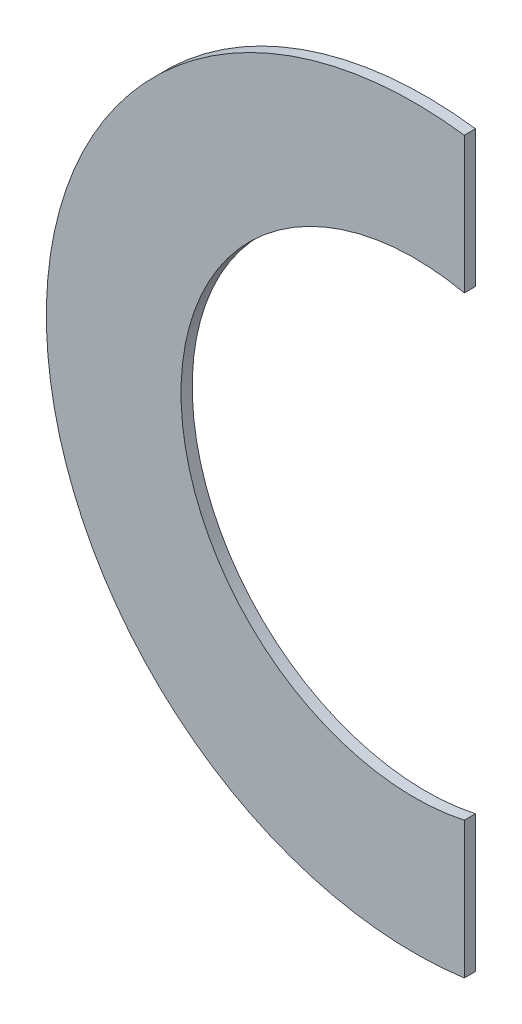
ISO-10303-21;
HEADER;
FILE_DESCRIPTION(('STEP AP214'),'2;1');
FILE_NAME('part.step','',(''),(''),'','','');
FILE_SCHEMA(('AUTOMOTIVE_DESIGN { 1 0 10303 214 1 1 1 1 }'));
ENDSEC;
DATA;
#1=APPLICATION_CONTEXT('core data for automotive mechanical design processes');
#2=APPLICATION_PROTOCOL_DEFINITION('international standard','automotive_design',2000,#1);
#3=PRODUCT_CONTEXT('',#1,'mechanical');
#4=PRODUCT('Part','Part','',(#3));
#5=PRODUCT_RELATED_PRODUCT_CATEGORY('part','',(#4));
#6=PRODUCT_DEFINITION_FORMATION('','',#4);
#7=PRODUCT_DEFINITION_CONTEXT('part definition',#1,'design');
#8=PRODUCT_DEFINITION('design','',#6,#7);
#9=PRODUCT_DEFINITION_SHAPE('','',#8);
#10=(LENGTH_UNIT() NAMED_UNIT(*) SI_UNIT(.MILLI.,.METRE.));
#11=(NAMED_UNIT(*) PLANE_ANGLE_UNIT() SI_UNIT($,.RADIAN.));
#12=(NAMED_UNIT(*) SI_UNIT($,.STERADIAN.) SOLID_ANGLE_UNIT());
#13=UNCERTAINTY_MEASURE_WITH_UNIT(LENGTH_MEASURE(1.E-05),#10,'distance_accuracy_value','');
#14=(GEOMETRIC_REPRESENTATION_CONTEXT(3) GLOBAL_UNCERTAINTY_ASSIGNED_CONTEXT((#13)) GLOBAL_UNIT_ASSIGNED_CONTEXT((#10,
#11,#12)) REPRESENTATION_CONTEXT('',''));
#15=CARTESIAN_POINT('',(0.,0.,0.));
#16=DIRECTION('',(0.,0.,1.));
#17=DIRECTION('',(1.,0.,0.));
#18=AXIS2_PLACEMENT_3D('',#15,#16,#17);
#19=CARTESIAN_POINT('',(0.,0.,0.05));
#20=DIRECTION('',(0.,0.,1.));
#21=DIRECTION('',(1.,0.,0.));
#22=AXIS2_PLACEMENT_3D('',#19,#20,#21);
#23=PLANE('',#22);
#24=DIRECTION('',(0.,1.,0.));
#25=VECTOR('',#24,1.);
#26=CARTESIAN_POINT('',(-0.546694,0.,0.05));
#27=LINE('',#26,#25);
#28=CARTESIAN_POINT('',(-0.546694,-1.60173186517877,0.05));
#29=VERTEX_POINT('',#28);
#30=CARTESIAN_POINT('',(-0.546694,-0.991637831880797,0.05));
#31=VERTEX_POINT('',#30);
#32=EDGE_CURVE('E54',#29,#31,#27,.T.);
#33=ORIENTED_EDGE('',*,*,#32,.T.);
#34=CARTESIAN_POINT('',(-0.7682882978671,0.027718,0.05));
#35=DIRECTION('',(0.,0.,1.));
#36=DIRECTION('',(1.,0.,0.));
#37=AXIS2_PLACEMENT_3D('',#34,#35,#36);
#38=CIRCLE('',#37,1.043163623233);
#39=CARTESIAN_POINT('',(-0.546694,1.0470738318809,0.05));
#40=VERTEX_POINT('',#39);
#41=EDGE_CURVE('E20',#31,#40,#38,.F.);
#42=ORIENTED_EDGE('',*,*,#41,.T.);
#43=DIRECTION('',(0.,1.,0.));
#44=VECTOR('',#43,1.);
#45=CARTESIAN_POINT('',(-0.546694,1.047073831881,0.05));
#46=LINE('',#45,#44);
#47=CARTESIAN_POINT('',(-0.546694000000031,1.65716686517854,0.05));
#48=VERTEX_POINT('',#47);
#49=EDGE_CURVE('E67',#48,#40,#46,.F.);
#50=ORIENTED_EDGE('',*,*,#49,.F.);
#51=CARTESIAN_POINT('',(-0.7682893867849,0.0277175,0.05));
#52=DIRECTION('',(0.,0.,1.));
#53=DIRECTION('',(1.,0.,0.));
#54=AXIS2_PLACEMENT_3D('',#51,#52,#53);
#55=CIRCLE('',#54,1.644448159452);
#56=EDGE_CURVE('E58',#29,#48,#55,.F.);
#57=ORIENTED_EDGE('',*,*,#56,.F.);
#58=EDGE_LOOP('',(#33,#42,#50,#57));
#59=FACE_BOUND('',#58,.T.);
#60=ADVANCED_FACE('F17',(#59),#23,.T.);
#61=CARTESIAN_POINT('',(-0.7682882978671,0.027718,0.));
#62=DIRECTION('',(0.,0.,1.));
#63=DIRECTION('',(1.,0.,0.));
#64=AXIS2_PLACEMENT_3D('',#61,#62,#63);
#65=CYLINDRICAL_SURFACE('',#64,1.043163623233);
#66=ORIENTED_EDGE('',*,*,#41,.F.);
#67=DIRECTION('',(0.,0.,-1.));
#68=VECTOR('',#67,1.);
#69=CARTESIAN_POINT('',(-0.546694,-0.9916378318808,0.));
#70=LINE('',#69,#68);
#71=CARTESIAN_POINT('',(-0.546694,-0.991637831880797,0.));
#72=VERTEX_POINT('',#71);
#73=EDGE_CURVE('E65',#72,#31,#70,.F.);
#74=ORIENTED_EDGE('',*,*,#73,.F.);
#75=CARTESIAN_POINT('',(-0.7682882978671,0.027718,0.));
#76=DIRECTION('',(0.,0.,1.));
#77=DIRECTION('',(1.,0.,0.));
#78=AXIS2_PLACEMENT_3D('',#75,#76,#77);
#79=CIRCLE('',#78,1.043163623233);
#80=CARTESIAN_POINT('',(-0.546694,1.0470738318809,0.));
#81=VERTEX_POINT('',#80);
#82=EDGE_CURVE('E71',#72,#81,#79,.F.);
#83=ORIENTED_EDGE('',*,*,#82,.T.);
#84=DIRECTION('',(0.,0.,-1.));
#85=VECTOR('',#84,1.);
#86=CARTESIAN_POINT('',(-0.546694,1.047073831881,0.));
#87=LINE('',#86,#85);
#88=EDGE_CURVE('E66',#40,#81,#87,.T.);
#89=ORIENTED_EDGE('',*,*,#88,.F.);
#90=EDGE_LOOP('',(#66,#74,#83,#89));
#91=FACE_BOUND('',#90,.T.);
#92=ADVANCED_FACE('F63',(#91),#65,.F.);
#93=CARTESIAN_POINT('',(-0.546694,1.047073831881,0.));
#94=DIRECTION('',(1.,0.,0.));
#95=DIRECTION('',(0.,0.,-1.));
#96=AXIS2_PLACEMENT_3D('',#93,#94,#95);
#97=PLANE('',#96);
#98=ORIENTED_EDGE('',*,*,#88,.T.);
#99=DIRECTION('',(0.,1.,0.));
#100=VECTOR('',#99,1.);
#101=CARTESIAN_POINT('',(-0.546694,0.,0.));
#102=LINE('',#101,#100);
#103=CARTESIAN_POINT('',(-0.546694000000031,1.65716686517854,0.));
#104=VERTEX_POINT('',#103);
#105=EDGE_CURVE('E81',#81,#104,#102,.T.);
#106=ORIENTED_EDGE('',*,*,#105,.T.);
#107=DIRECTION('',(0.,0.,1.));
#108=VECTOR('',#107,1.);
#109=CARTESIAN_POINT('',(-0.546694000000063,1.65716686517854,0.));
#110=LINE('',#109,#108);
#111=EDGE_CURVE('E69',#48,#104,#110,.F.);
#112=ORIENTED_EDGE('',*,*,#111,.F.);
#113=ORIENTED_EDGE('',*,*,#49,.T.);
#114=EDGE_LOOP('',(#98,#106,#112,#113));
#115=FACE_BOUND('',#114,.T.);
#116=ADVANCED_FACE('F88',(#115),#97,.T.);
#117=CARTESIAN_POINT('',(-0.7682893867849,0.0277175,0.));
#118=DIRECTION('',(0.,0.,1.));
#119=DIRECTION('',(1.,0.,0.));
#120=AXIS2_PLACEMENT_3D('',#117,#118,#119);
#121=CYLINDRICAL_SURFACE('',#120,1.644448159452);
#122=ORIENTED_EDGE('',*,*,#111,.T.);
#123=CARTESIAN_POINT('',(-0.7682893867849,0.0277175,0.));
#124=DIRECTION('',(0.,0.,1.));
#125=DIRECTION('',(1.,0.,0.));
#126=AXIS2_PLACEMENT_3D('',#123,#124,#125);
#127=CIRCLE('',#126,1.644448159452);
#128=CARTESIAN_POINT('',(-0.546694,-1.60173186517877,0.));
#129=VERTEX_POINT('',#128);
#130=EDGE_CURVE('E26',#104,#129,#127,.T.);
#131=ORIENTED_EDGE('',*,*,#130,.T.);
#132=DIRECTION('',(0.,0.,-1.));
#133=VECTOR('',#132,1.);
#134=CARTESIAN_POINT('',(-0.546694,-1.601731865179,0.));
#135=LINE('',#134,#133);
#136=EDGE_CURVE('E34',#29,#129,#135,.T.);
#137=ORIENTED_EDGE('',*,*,#136,.F.);
#138=ORIENTED_EDGE('',*,*,#56,.T.);
#139=EDGE_LOOP('',(#122,#131,#137,#138));
#140=FACE_BOUND('',#139,.T.);
#141=ADVANCED_FACE('F83',(#140),#121,.T.);
#142=CARTESIAN_POINT('',(-0.546694,-1.601731865179,0.));
#143=DIRECTION('',(1.,0.,0.));
#144=DIRECTION('',(0.,0.,-1.));
#145=AXIS2_PLACEMENT_3D('',#142,#143,#144);
#146=PLANE('',#145);
#147=ORIENTED_EDGE('',*,*,#136,.T.);
#148=DIRECTION('',(0.,1.,0.));
#149=VECTOR('',#148,1.);
#150=CARTESIAN_POINT('',(-0.546694,0.,0.));
#151=LINE('',#150,#149);
#152=EDGE_CURVE('E11',#129,#72,#151,.T.);
#153=ORIENTED_EDGE('',*,*,#152,.T.);
#154=ORIENTED_EDGE('',*,*,#73,.T.);
#155=ORIENTED_EDGE('',*,*,#32,.F.);
#156=EDGE_LOOP('',(#147,#153,#154,#155));
#157=FACE_BOUND('',#156,.T.);
#158=ADVANCED_FACE('F68',(#157),#146,.T.);
#159=CARTESIAN_POINT('',(0.,0.,0.));
#160=DIRECTION('',(0.,0.,1.));
#161=DIRECTION('',(1.,0.,0.));
#162=AXIS2_PLACEMENT_3D('',#159,#160,#161);
#163=PLANE('',#162);
#164=ORIENTED_EDGE('',*,*,#130,.F.);
#165=ORIENTED_EDGE('',*,*,#105,.F.);
#166=ORIENTED_EDGE('',*,*,#82,.F.);
#167=ORIENTED_EDGE('',*,*,#152,.F.);
#168=EDGE_LOOP('',(#164,#165,#166,#167));
#169=FACE_BOUND('',#168,.T.);
#170=ADVANCED_FACE('F91',(#169),#163,.F.);
#171=CLOSED_SHELL('',(#60,#92,#116,#141,#158,#170));
#172=MANIFOLD_SOLID_BREP('B1',#171);
#173=ADVANCED_BREP_SHAPE_REPRESENTATION('',(#18,#172),#14);
#174=SHAPE_DEFINITION_REPRESENTATION(#9,#173);
ENDSEC;
END-ISO-10303-21;
